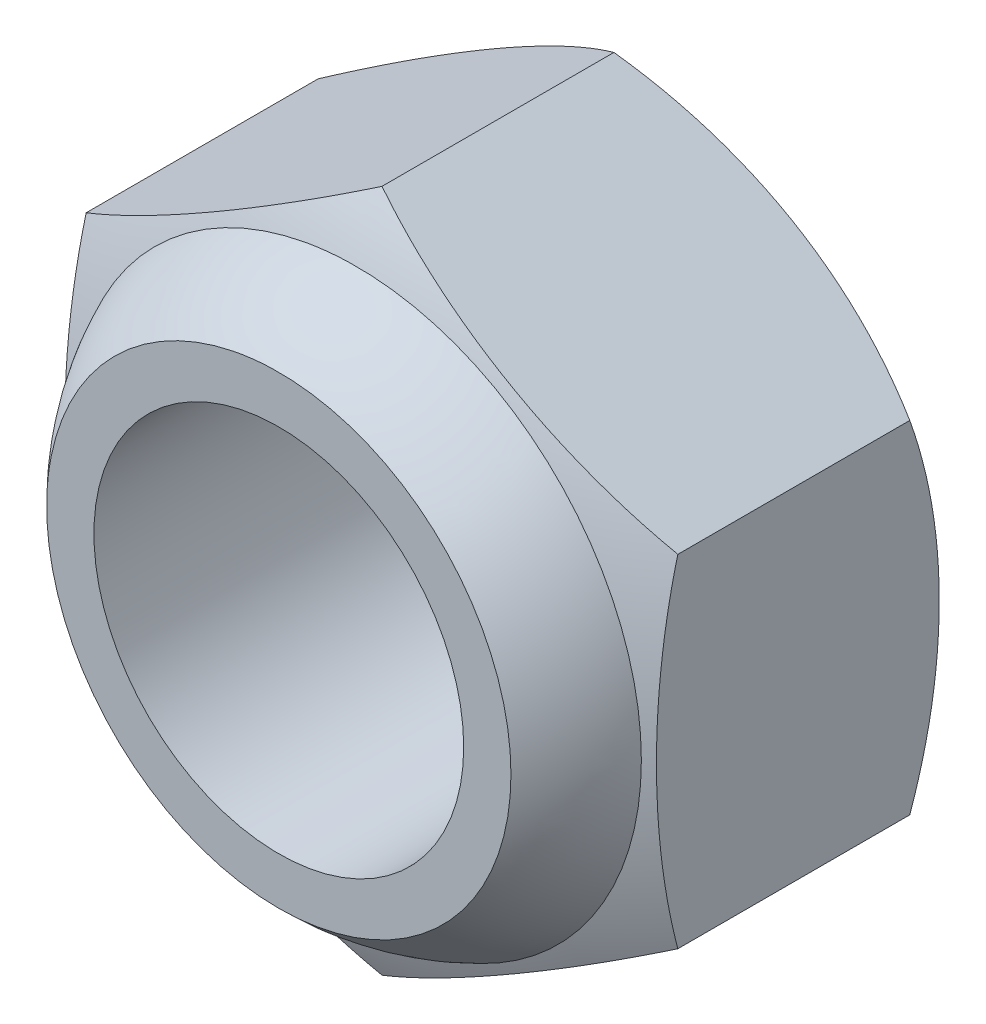
ISO-10303-21;
HEADER;
FILE_DESCRIPTION(('STEP AP214'),'2;1');
FILE_NAME('part.step','',(''),(''),'','','');
FILE_SCHEMA(('AUTOMOTIVE_DESIGN { 1 0 10303 214 1 1 1 1 }'));
ENDSEC;
DATA;
#1=APPLICATION_CONTEXT('core data for automotive mechanical design processes');
#2=APPLICATION_PROTOCOL_DEFINITION('international standard','automotive_design',2000,#1);
#3=PRODUCT_CONTEXT('',#1,'mechanical');
#4=PRODUCT('Part','Part','',(#3));
#5=PRODUCT_RELATED_PRODUCT_CATEGORY('part','',(#4));
#6=PRODUCT_DEFINITION_FORMATION('','',#4);
#7=PRODUCT_DEFINITION_CONTEXT('part definition',#1,'design');
#8=PRODUCT_DEFINITION('design','',#6,#7);
#9=PRODUCT_DEFINITION_SHAPE('','',#8);
#10=(LENGTH_UNIT() NAMED_UNIT(*) SI_UNIT(.MILLI.,.METRE.));
#11=(NAMED_UNIT(*) PLANE_ANGLE_UNIT() SI_UNIT($,.RADIAN.));
#12=(NAMED_UNIT(*) SI_UNIT($,.STERADIAN.) SOLID_ANGLE_UNIT());
#13=UNCERTAINTY_MEASURE_WITH_UNIT(LENGTH_MEASURE(1.E-05),#10,'distance_accuracy_value','');
#14=(GEOMETRIC_REPRESENTATION_CONTEXT(3) GLOBAL_UNCERTAINTY_ASSIGNED_CONTEXT((#13)) GLOBAL_UNIT_ASSIGNED_CONTEXT((#10,
#11,#12)) REPRESENTATION_CONTEXT('',''));
#15=CARTESIAN_POINT('',(0.,0.,0.));
#16=DIRECTION('',(0.,0.,1.));
#17=DIRECTION('',(1.,0.,0.));
#18=AXIS2_PLACEMENT_3D('',#15,#16,#17);
#19=CARTESIAN_POINT('',(0.,0.,5.));
#20=DIRECTION('',(0.,0.,1.));
#21=DIRECTION('',(1.,0.,0.));
#22=AXIS2_PLACEMENT_3D('',#19,#20,#21);
#23=PLANE('',#22);
#24=CARTESIAN_POINT('',(0.,0.,5.));
#25=DIRECTION('',(0.,0.,-1.));
#26=DIRECTION('',(-1.,0.,0.));
#27=AXIS2_PLACEMENT_3D('',#24,#25,#26);
#28=CIRCLE('',#27,2.5);
#29=CARTESIAN_POINT('',(2.5,0.,5.));
#30=VERTEX_POINT('',#29);
#31=EDGE_CURVE('E48',#30,#30,#28,.T.);
#32=ORIENTED_EDGE('',*,*,#31,.T.);
#33=EDGE_LOOP('',(#32));
#34=FACE_BOUND('',#33,.T.);
#35=CARTESIAN_POINT('',(0.,0.,5.));
#36=DIRECTION('',(0.,0.,1.));
#37=DIRECTION('',(-1.,0.,0.));
#38=AXIS2_PLACEMENT_3D('',#35,#36,#37);
#39=CIRCLE('',#38,3.13877117364591);
#40=CARTESIAN_POINT('',(0.,-3.1387711736459,5.));
#41=VERTEX_POINT('',#40);
#42=CARTESIAN_POINT('',(3.13877117364591,0.,5.));
#43=VERTEX_POINT('',#42);
#44=EDGE_CURVE('E317',#41,#43,#39,.T.);
#45=ORIENTED_EDGE('',*,*,#44,.T.);
#46=CARTESIAN_POINT('',(0.,0.,5.));
#47=DIRECTION('',(0.,0.,1.));
#48=DIRECTION('',(-1.,0.,0.));
#49=AXIS2_PLACEMENT_3D('',#46,#47,#48);
#50=CIRCLE('',#49,3.13877117364591);
#51=EDGE_CURVE('E310',#43,#41,#50,.T.);
#52=ORIENTED_EDGE('',*,*,#51,.T.);
#53=EDGE_LOOP('',(#45,#52));
#54=FACE_BOUND('',#53,.T.);
#55=ADVANCED_FACE('F17',(#34,#54),#23,.T.);
#56=CARTESIAN_POINT('',(0.,0.,0.));
#57=DIRECTION('',(0.,0.,1.));
#58=DIRECTION('',(1.,0.,0.));
#59=AXIS2_PLACEMENT_3D('',#56,#57,#58);
#60=PLANE('',#59);
#61=CARTESIAN_POINT('',(0.,0.,0.));
#62=DIRECTION('',(0.,0.,1.));
#63=DIRECTION('',(-1.,0.,0.));
#64=AXIS2_PLACEMENT_3D('',#61,#62,#63);
#65=CIRCLE('',#64,2.5);
#66=CARTESIAN_POINT('',(2.5,0.,0.));
#67=VERTEX_POINT('',#66);
#68=EDGE_CURVE('E41',#67,#67,#65,.T.);
#69=ORIENTED_EDGE('',*,*,#68,.T.);
#70=EDGE_LOOP('',(#69));
#71=FACE_BOUND('',#70,.T.);
#72=CARTESIAN_POINT('',(0.,0.,0.));
#73=DIRECTION('',(0.,0.,-1.));
#74=DIRECTION('',(0.,-1.,0.));
#75=AXIS2_PLACEMENT_3D('',#72,#73,#74);
#76=CIRCLE('',#75,3.87626323775086);
#77=CARTESIAN_POINT('',(0.,-3.87626323775087,0.));
#78=VERTEX_POINT('',#77);
#79=EDGE_CURVE('E256',#78,#78,#76,.T.);
#80=ORIENTED_EDGE('',*,*,#79,.T.);
#81=EDGE_LOOP('',(#80));
#82=FACE_BOUND('',#81,.T.);
#83=ADVANCED_FACE('F282',(#71,#82),#60,.F.);
#84=CARTESIAN_POINT('',(0.,-4.618802153517,0.));
#85=DIRECTION('',(0.5,-0.866025403784439,0.));
#86=DIRECTION('',(0.,0.,-1.));
#87=AXIS2_PLACEMENT_3D('',#84,#85,#86);
#88=PLANE('',#87);
#89=CARTESIAN_POINT('',(2.,-3.46410161513776,6.96188899722144));
#90=DIRECTION('',(0.5,-0.866025403784439,0.));
#91=DIRECTION('',(0.,0.,1.));
#92=AXIS2_PLACEMENT_3D('',#89,#90,#91);
#93=CIRCLE('',#92,6.89153938521516);
#94=CARTESIAN_POINT('',(0.,-4.618802153517,0.468817169138954));
#95=VERTEX_POINT('',#94);
#96=CARTESIAN_POINT('',(4.,-2.30940107675849,0.468817169138954));
#97=VERTEX_POINT('',#96);
#98=EDGE_CURVE('E408',#95,#97,#93,.T.);
#99=ORIENTED_EDGE('',*,*,#98,.T.);
#100=DIRECTION('',(0.,0.,1.));
#101=VECTOR('',#100,1.);
#102=CARTESIAN_POINT('',(4.,-2.3094010767585,0.));
#103=LINE('',#102,#101);
#104=CARTESIAN_POINT('',(4.,-2.30940107675849,3.60465735901138));
#105=VERTEX_POINT('',#104);
#106=EDGE_CURVE('E11',#97,#105,#103,.T.);
#107=ORIENTED_EDGE('',*,*,#106,.T.);
#108=CARTESIAN_POINT('',(0.,-4.61880215351702,3.60465735901137));
#109=CARTESIAN_POINT('',(0.0844692944981408,-4.57001999356269,3.63030472736693));
#110=CARTESIAN_POINT('',(0.169328832522611,-4.52097734452246,3.65415830776273));
#111=CARTESIAN_POINT('',(0.338245354867737,-4.42336415488436,3.69794268289454));
#112=CARTESIAN_POINT('',(0.422290334925305,-4.37480040655943,3.71793490760941));
#113=CARTESIAN_POINT('',(0.589958993725086,-4.27799811130783,3.75433795389298));
#114=CARTESIAN_POINT('',(0.67357579049099,-4.22976256836302,3.77078855096586));
#115=CARTESIAN_POINT('',(0.840801305462031,-4.13334877989157,3.80041271407598));
#116=CARTESIAN_POINT('',(0.92440761145618,-4.08517164061104,3.81360355710757));
#117=CARTESIAN_POINT('',(1.09134376760302,-3.98881247462849,3.83690021581602));
#118=CARTESIAN_POINT('',(1.17467211300332,-3.94063233408011,3.84702467062216));
#119=CARTESIAN_POINT('',(1.34047210813282,-3.84476504314221,3.86418970173584));
#120=CARTESIAN_POINT('',(1.42294078971601,-3.79707963948973,3.87126870625553));
#121=CARTESIAN_POINT('',(1.58765940562038,-3.7019423477994,3.88251184995009));
#122=CARTESIAN_POINT('',(1.66990837366383,-3.6544904836348,3.88669037848018));
#123=CARTESIAN_POINT('',(1.83478194516825,-3.55941130840055,3.89225175692093));
#124=CARTESIAN_POINT('',(1.91740685696352,-3.51178396364291,3.89362478718686));
#125=CARTESIAN_POINT('',(2.08250545377078,-3.41646989105462,3.89362277834582));
#126=CARTESIAN_POINT('',(2.16497920620485,-3.3687832799571,3.89225065532059));
#127=CARTESIAN_POINT('',(2.32968152694303,-3.27359746287484,3.88669241097333));
#128=CARTESIAN_POINT('',(2.41191021491103,-3.22609808011147,3.88251293097547));
#129=CARTESIAN_POINT('',(2.57671447766954,-3.13098954047092,3.87127034005281));
#130=CARTESIAN_POINT('',(2.6592894626106,-3.08338122431807,3.86419144326954));
#131=CARTESIAN_POINT('',(2.82528610017591,-2.98766389195938,3.84702827093319));
#132=CARTESIAN_POINT('',(2.90870473321059,-2.93955645276478,3.83690596807769));
#133=CARTESIAN_POINT('',(3.07523322781194,-2.84339413208622,3.81366224418682));
#134=CARTESIAN_POINT('',(3.15834283424106,-2.79533931043673,3.80053874191018));
#135=CARTESIAN_POINT('',(3.32497836598632,-2.69903594960985,3.77102029167012));
#136=CARTESIAN_POINT('',(3.40850042541312,-2.6507901049521,3.75459463367981));
#137=CARTESIAN_POINT('',(3.57628149353847,-2.55392052562894,3.71820656176609));
#138=CARTESIAN_POINT('',(3.66053282024238,-2.50530194392586,3.69819488921132));
#139=CARTESIAN_POINT('',(3.83000418825486,-2.40751071558443,3.65432348730328));
#140=CARTESIAN_POINT('',(3.91521120064901,-2.3583456837128,3.63039648646879));
#141=CARTESIAN_POINT('',(4.00000000000002,-2.30940107675849,3.60465735901137));
#142=B_SPLINE_CURVE_WITH_KNOTS('',3,(#108,#109,#110,#111,#112,#113,#114,#115,#116,#117,#118,
#119,#120,#121,#122,#123,#124,#125,#126,#127,#128,#129,#130,#131,#132,#133,#134,#135,#136,#137,
#138,#139,#140,#141),.UNSPECIFIED.,.F.,.F.,(4,2,2,2,2,2,2,2,2,2,2,2,2,2,2,2,4),(0.,
0.302555167937506,0.599807154182585,0.89352299937183,1.1856470235933,1.47595797738453,
1.76248986326301,2.04758989531865,2.33368612057893,2.61947859704127,2.90459734842293,
3.19128950979145,3.48172429099673,3.77236109400859,4.06583748402699,4.36370667585589,
4.66736915586006),.UNSPECIFIED.);
#143=CARTESIAN_POINT('',(0.,-4.61880215351701,3.60465735901138));
#144=VERTEX_POINT('',#143);
#145=EDGE_CURVE('E149',#105,#144,#142,.F.);
#146=ORIENTED_EDGE('',*,*,#145,.T.);
#147=DIRECTION('',(0.,0.,1.));
#148=VECTOR('',#147,1.);
#149=CARTESIAN_POINT('',(0.,-4.618802153517,0.));
#150=LINE('',#149,#148);
#151=EDGE_CURVE('E28',#95,#144,#150,.T.);
#152=ORIENTED_EDGE('',*,*,#151,.F.);
#153=EDGE_LOOP('',(#99,#107,#146,#152));
#154=FACE_BOUND('',#153,.T.);
#155=ADVANCED_FACE('F274',(#154),#88,.T.);
#156=CARTESIAN_POINT('',(4.,-2.3094010767585,0.));
#157=DIRECTION('',(1.,0.,0.));
#158=DIRECTION('',(0.,-1.,0.));
#159=AXIS2_PLACEMENT_3D('',#156,#157,#158);
#160=PLANE('',#159);
#161=CARTESIAN_POINT('',(4.,0.,6.96188899722144));
#162=DIRECTION('',(1.,0.,0.));
#163=DIRECTION('',(0.,0.,1.));
#164=AXIS2_PLACEMENT_3D('',#161,#162,#163);
#165=CIRCLE('',#164,6.89153938521516);
#166=CARTESIAN_POINT('',(4.,2.30940107675851,0.468817169138955));
#167=VERTEX_POINT('',#166);
#168=EDGE_CURVE('E415',#97,#167,#165,.T.);
#169=ORIENTED_EDGE('',*,*,#168,.T.);
#170=DIRECTION('',(0.,0.,1.));
#171=VECTOR('',#170,1.);
#172=CARTESIAN_POINT('',(4.,2.3094010767585,0.));
#173=LINE('',#172,#171);
#174=CARTESIAN_POINT('',(4.,2.30940107675851,3.60465735901138));
#175=VERTEX_POINT('',#174);
#176=EDGE_CURVE('E217',#167,#175,#173,.T.);
#177=ORIENTED_EDGE('',*,*,#176,.T.);
#178=CARTESIAN_POINT('',(4.00000000000002,0.,3.89362378223286));
#179=CARTESIAN_POINT('',(3.99998819719664,0.095038303610354,3.89362514646326));
#180=CARTESIAN_POINT('',(3.99996641984743,0.190078017092024,3.8922461806946));
#181=CARTESIAN_POINT('',(3.9999370917434,0.380104121350534,3.88668745073181));
#182=CARTESIAN_POINT('',(3.99992954530124,0.475090487244996,3.88250683801991));
#183=CARTESIAN_POINT('',(3.99996301337216,0.665522437432981,3.8712676584555));
#184=CARTESIAN_POINT('',(4.0000043487273,0.760966914781735,3.86419027857336));
#185=CARTESIAN_POINT('',(4.00006431956318,0.95278713333542,3.84703220467505));
#186=CARTESIAN_POINT('',(4.00008266520791,1.04915962486289,3.83691511926635));
#187=CARTESIAN_POINT('',(4.00006848104863,1.24092805305444,3.81373520518023));
#188=CARTESIAN_POINT('',(4.00003627443393,1.3363263005841,3.80069154273266));
#189=CARTESIAN_POINT('',(4.00000044981916,1.52809174375574,3.77129967825031));
#190=CARTESIAN_POINT('',(3.99999727192057,1.62445174942962,3.75490444642419));
#191=CARTESIAN_POINT('',(3.99999504976463,1.81835174796744,3.71853512282235));
#192=CARTESIAN_POINT('',(3.99999608349627,1.91588034971443,3.6985001336654));
#193=CARTESIAN_POINT('',(3.99999866535903,2.11224331435436,3.65452386718516));
#194=CARTESIAN_POINT('',(4.00000022401524,2.21106101515489,3.63050823308595));
#195=CARTESIAN_POINT('',(4.00000000000001,2.30940107675851,3.60465735901137));
#196=B_SPLINE_CURVE_WITH_KNOTS('',3,(#178,#179,#180,#181,#182,#183,#184,#185,#186,#187,#188,
#189,#190,#191,#192,#193,#194,#195),.UNSPECIFIED.,.F.,.F.,(4,2,2,2,2,2,2,2,4),(0.,
0.285106981500713,0.570300350665466,0.857376060706741,1.14803572855585,1.43684471439209,
1.73002516897892,2.0286590447242,2.33367755767986),.UNSPECIFIED.);
#197=CARTESIAN_POINT('',(4.,0.,3.89362378223287));
#198=VERTEX_POINT('',#197);
#199=EDGE_CURVE('E237',#175,#198,#196,.F.);
#200=ORIENTED_EDGE('',*,*,#199,.T.);
#201=CARTESIAN_POINT('',(4.00000000000002,-2.30940107675849,3.60465735901137));
#202=CARTESIAN_POINT('',(4.00000027122968,-2.21106723241989,3.63050657374951));
#203=CARTESIAN_POINT('',(3.99999935495743,-2.11225575649298,3.65452053145531));
#204=CARTESIAN_POINT('',(3.99999836565819,-1.91590083239483,3.69849476832372));
#205=CARTESIAN_POINT('',(3.99999827541718,-1.81837401027911,3.71852924357877));
#206=CARTESIAN_POINT('',(4.00000187121471,-1.62447355417245,3.75489864212389));
#207=CARTESIAN_POINT('',(4.00000548848029,-1.52811128434888,3.77129431973537));
#208=CARTESIAN_POINT('',(4.00003989558403,-1.33633784515323,3.80068842051633));
#209=CARTESIAN_POINT('',(4.00007028047921,-1.24093384634988,3.81373374477522));
#210=CARTESIAN_POINT('',(4.00008085356158,-1.04916621909009,3.83691508710785));
#211=CARTESIAN_POINT('',(4.00006072541666,-0.952800326261776,3.84703232642177));
#212=CARTESIAN_POINT('',(3.999999489555,-0.760988707923016,3.86419055651116));
#213=CARTESIAN_POINT('',(3.999958642595,-0.665546220800909,3.87126781011144));
#214=CARTESIAN_POINT('',(3.99992656419787,-0.475113960358615,3.88250694020535));
#215=CARTESIAN_POINT('',(3.99993501139162,-0.380125286394425,3.88668750180295));
#216=CARTESIAN_POINT('',(3.99996581253374,-0.190090588048334,3.89224624607006));
#217=CARTESIAN_POINT('',(3.99998816285156,-0.0950445851081156,3.89362515994118));
#218=CARTESIAN_POINT('',(4.00000000000002,0.,3.89362378223286));
#219=B_SPLINE_CURVE_WITH_KNOTS('',3,(#201,#202,#203,#204,#205,#206,#207,#208,#209,#210,#211,
#212,#213,#214,#215,#216,#217,#218),.UNSPECIFIED.,.F.,.F.,(4,2,2,2,2,2,2,2,4),(0.,
0.304999192432699,0.603627526743333,0.896814923469142,1.18564168877485,1.47628170630641,
1.76335141497695,2.04855169649338,2.33367753406475),.UNSPECIFIED.);
#220=EDGE_CURVE('E328',#198,#105,#219,.F.);
#221=ORIENTED_EDGE('',*,*,#220,.T.);
#222=ORIENTED_EDGE('',*,*,#106,.F.);
#223=EDGE_LOOP('',(#169,#177,#200,#221,#222));
#224=FACE_BOUND('',#223,.T.);
#225=ADVANCED_FACE('F19',(#224),#160,.T.);
#226=CARTESIAN_POINT('',(-4.,-2.3094010767585,0.));
#227=DIRECTION('',(-0.5,-0.866025403784439,0.));
#228=DIRECTION('',(-0.866025403784439,0.5,0.));
#229=AXIS2_PLACEMENT_3D('',#226,#227,#228);
#230=PLANE('',#229);
#231=CARTESIAN_POINT('',(-2.,-3.46410161513775,6.96188899722144));
#232=DIRECTION('',(-0.5,-0.866025403784439,0.));
#233=DIRECTION('',(0.,0.,1.));
#234=AXIS2_PLACEMENT_3D('',#231,#232,#233);
#235=CIRCLE('',#234,6.89153938521516);
#236=CARTESIAN_POINT('',(-4.,-2.3094010767585,0.468817169138954));
#237=VERTEX_POINT('',#236);
#238=EDGE_CURVE('E425',#237,#95,#235,.T.);
#239=ORIENTED_EDGE('',*,*,#238,.T.);
#240=ORIENTED_EDGE('',*,*,#151,.T.);
#241=CARTESIAN_POINT('',(-4.00000000000001,-2.30940107675851,3.60465735901137));
#242=CARTESIAN_POINT('',(-3.9152166421546,-2.35834260084172,3.63039481648444));
#243=CARTESIAN_POINT('',(-3.83001534755885,-2.40750500453119,3.65432015702155));
#244=CARTESIAN_POINT('',(-3.66055180915433,-2.50529339792776,3.69818955199515));
#245=CARTESIAN_POINT('',(-3.57630256079402,-2.55391178566992,3.71820072023641));
#246=CARTESIAN_POINT('',(-3.40852189404581,-2.65078266090926,3.75458886911543));
#247=CARTESIAN_POINT('',(-3.32499813788931,-2.69903001580491,3.77101496352426));
#248=CARTESIAN_POINT('',(-3.15835485722455,-2.79533625197662,3.80053567392391));
#249=CARTESIAN_POINT('',(-3.07523919311712,-2.84339246938167,3.81366086730653));
#250=CARTESIAN_POINT('',(-2.90871444719129,-2.93954906299808,3.83690515599298));
#251=CARTESIAN_POINT('',(-2.8253056893881,-2.98764936271224,3.84702689628129));
#252=CARTESIAN_POINT('',(-2.65932290272083,-3.08335875256089,3.86418936407551));
#253=CARTESIAN_POINT('',(-2.57675185821734,-3.13096624760365,3.87126787714157));
#254=CARTESIAN_POINT('',(-2.41194858762576,-3.22607716695744,3.8825103840425));
#255=CARTESIAN_POINT('',(-2.32971694214352,-3.27357976319644,3.88668992245678));
#256=CARTESIAN_POINT('',(-2.16500085284224,-3.36877361974655,3.89224929964395));
#257=CARTESIAN_POINT('',(-2.08251628222238,-3.41646505745475,3.89362227368176));
#258=CARTESIAN_POINT('',(-1.91741666662083,-3.51177688137877,3.8936252920098));
#259=CARTESIAN_POINT('',(-1.83480157008172,-3.55939717836943,3.89225310654109));
#260=CARTESIAN_POINT('',(-1.66994188440145,-3.65446845632234,3.8866928662485));
#261=CARTESIAN_POINT('',(-1.58769699014244,-3.70191946281041,3.88251439498581));
#262=CARTESIAN_POINT('',(-1.4229795190403,-3.79705894475036,3.87127117953101));
#263=CARTESIAN_POINT('',(-1.34050792449406,-3.84474739536289,3.8641918040966));
#264=CARTESIAN_POINT('',(-1.17469408454023,-3.94062270126894,3.84702606551676));
#265=CARTESIAN_POINT('',(-1.09135480916674,-3.98880777226604,3.83690104432864));
#266=CARTESIAN_POINT('',(-0.924412272617986,-4.08516726890055,3.81360492429188));
#267=CARTESIAN_POINT('',(-0.840810469038299,-4.13333986302364,3.80041575046162));
#268=CARTESIAN_POINT('',(-0.673591543762774,-4.22974839930192,3.77079383649159));
#269=CARTESIAN_POINT('',(-0.589976859258258,-4.27798323652641,3.75434368147481));
#270=CARTESIAN_POINT('',(-0.422308931183302,-4.374786542287,3.71794072667306));
#271=CARTESIAN_POINT('',(-0.338262597283965,-4.42335199926371,3.69794800391944));
#272=CARTESIAN_POINT('',(-0.169339483287757,-4.5209705378079,3.65416163598582));
#273=CARTESIAN_POINT('',(-0.0844747351583005,-4.57001680556475,3.63030640598292));
#274=CARTESIAN_POINT('',(0.,-4.61880215351702,3.60465735901137));
#275=B_SPLINE_CURVE_WITH_KNOTS('',3,(#241,#242,#243,#244,#245,#246,#247,#248,#249,#250,#251,
#252,#253,#254,#255,#256,#257,#258,#259,#260,#261,#262,#263,#264,#265,#266,#267,#268,#269,#270,
#271,#272,#273,#274),.UNSPECIFIED.,.F.,.F.,(4,2,2,2,2,2,2,2,2,2,2,2,2,2,2,2,4),(0.,
0.303643049474794,0.601506360130029,0.894989571452145,1.18564473283467,1.47604316449904,
1.7627237817914,2.04785505249492,2.33368291146376,2.61974302869812,2.90483117508257,
3.19137526934037,3.48172200127552,3.77382700070112,4.06753614873544,4.36479439404181,
4.66736914757197),.UNSPECIFIED.);
#276=CARTESIAN_POINT('',(-4.,-2.3094010767585,3.60465735901138));
#277=VERTEX_POINT('',#276);
#278=EDGE_CURVE('E136',#144,#277,#275,.F.);
#279=ORIENTED_EDGE('',*,*,#278,.T.);
#280=DIRECTION('',(0.,0.,1.));
#281=VECTOR('',#280,1.);
#282=CARTESIAN_POINT('',(-4.,-2.3094010767585,0.));
#283=LINE('',#282,#281);
#284=EDGE_CURVE('E124',#237,#277,#283,.T.);
#285=ORIENTED_EDGE('',*,*,#284,.F.);
#286=EDGE_LOOP('',(#239,#240,#279,#285));
#287=FACE_BOUND('',#286,.T.);
#288=ADVANCED_FACE('F141',(#287),#230,.T.);
#289=CARTESIAN_POINT('',(0.,0.,0.));
#290=DIRECTION('',(0.,0.,1.));
#291=DIRECTION('',(-1.,0.,0.));
#292=AXIS2_PLACEMENT_3D('',#289,#290,#291);
#293=CYLINDRICAL_SURFACE('',#292,2.5);
#294=ORIENTED_EDGE('',*,*,#68,.F.);
#295=EDGE_LOOP('',(#294));
#296=FACE_BOUND('',#295,.T.);
#297=ORIENTED_EDGE('',*,*,#31,.F.);
#298=EDGE_LOOP('',(#297));
#299=FACE_BOUND('',#298,.T.);
#300=ADVANCED_FACE('F453',(#296,#299),#293,.F.);
#301=CARTESIAN_POINT('',(-4.,2.3094010767585,0.));
#302=DIRECTION('',(-1.,0.,0.));
#303=DIRECTION('',(0.,1.,0.));
#304=AXIS2_PLACEMENT_3D('',#301,#302,#303);
#305=PLANE('',#304);
#306=CARTESIAN_POINT('',(-4.,0.,6.96188899722144));
#307=DIRECTION('',(-1.,0.,0.));
#308=DIRECTION('',(0.,0.,-1.));
#309=AXIS2_PLACEMENT_3D('',#306,#307,#308);
#310=CIRCLE('',#309,6.89153938521516);
#311=CARTESIAN_POINT('',(-4.,2.30940107675851,0.468817169138955));
#312=VERTEX_POINT('',#311);
#313=EDGE_CURVE('E135',#312,#237,#310,.T.);
#314=ORIENTED_EDGE('',*,*,#313,.T.);
#315=ORIENTED_EDGE('',*,*,#284,.T.);
#316=CARTESIAN_POINT('',(-4.00000000000001,2.30940107675852,3.60465735901137));
#317=CARTESIAN_POINT('',(-4.00000027343519,2.21106723169752,3.63050657126607));
#318=CARTESIAN_POINT('',(-3.99999935604814,2.11225575613005,3.65452053022819));
#319=CARTESIAN_POINT('',(-3.99999836458848,1.91590083273079,3.69849476953034));
#320=CARTESIAN_POINT('',(-3.99999827330088,1.81837401095487,3.718529245964));
#321=CARTESIAN_POINT('',(-4.00000187328781,1.62447355348307,3.75489863978901));
#322=CARTESIAN_POINT('',(-4.00000549567526,1.52811128199177,3.77129431163041));
#323=CARTESIAN_POINT('',(-4.00003988849094,1.33633784745697,3.80068842850574));
#324=CARTESIAN_POINT('',(-4.00007025433994,1.24093385486368,3.8137337742194));
#325=CARTESIAN_POINT('',(-4.00008087970736,1.04916905430031,3.83691471371692));
#326=CARTESIAN_POINT('',(-4.00006082496388,0.952805992538138,3.8470316173734));
#327=CARTESIAN_POINT('',(-4.00000072633022,0.76099804997121,3.8641893654434));
#328=CARTESIAN_POINT('',(-3.99996093059071,0.665556401261039,3.87126641127105));
#329=CARTESIAN_POINT('',(-3.99992776672625,0.475123789878368,3.88250571666351));
#330=CARTESIAN_POINT('',(-3.99993409882734,0.380133924582625,3.88668660340242));
#331=CARTESIAN_POINT('',(-3.99997053087034,0.190096028443037,3.89224516532764));
#332=CARTESIAN_POINT('',(-4.00000062500256,0.0950480174907733,3.89362352542397));
#333=CARTESIAN_POINT('',(-3.99999937507315,-0.0950365040609221,3.89362403901066));
#334=CARTESIAN_POINT('',(-3.99996803845327,-0.19007301465877,3.89224652634774));
#335=CARTESIAN_POINT('',(-3.9999316661548,-0.380095045958781,3.88668908413055));
#336=CARTESIAN_POINT('',(-3.99992663888558,-0.475080540655441,3.8825082590217));
#337=CARTESIAN_POINT('',(-3.99996244114047,-0.665512376100452,3.87126885811452));
#338=CARTESIAN_POINT('',(-4.00000357444037,-0.760957605253441,3.86419141584224));
#339=CARTESIAN_POINT('',(-4.0000637522067,-0.952781435098894,3.84703296788322));
#340=CARTESIAN_POINT('',(-4.00008251400159,-1.04915678119248,3.83691550711605));
#341=CARTESIAN_POINT('',(-4.00006863149669,-1.24092805313335,3.8137351613305));
#342=CARTESIAN_POINT('',(-4.00003631525097,-1.33632630061143,3.80069153083501));
#343=CARTESIAN_POINT('',(-4.00000040838945,-1.52809174374655,3.77129969032299));
#344=CARTESIAN_POINT('',(-3.99999725997414,-1.62445174943656,3.75490444990342));
#345=CARTESIAN_POINT('',(-3.99999506193796,-1.81835174798674,3.71853511927142));
#346=CARTESIAN_POINT('',(-3.9999960896477,-1.91588034972967,3.69850013186973));
#347=CARTESIAN_POINT('',(-3.99999865907788,-2.11224331435859,3.65452386901399));
#348=CARTESIAN_POINT('',(-4.00000021131785,-2.2110610151522,3.63050823678573));
#349=CARTESIAN_POINT('',(-4.00000000000001,-2.30940107675851,3.60465735901137));
#350=B_SPLINE_CURVE_WITH_KNOTS('',3,(#316,#317,#318,#319,#320,#321,#322,#323,#324,#325,#326,
#327,#328,#329,#330,#331,#332,#333,#334,#335,#336,#337,#338,#339,#340,#341,#342,#343,#344,#345,
#346,#347,#348,#349),.UNSPECIFIED.,.F.,.F.,(4,2,2,2,2,2,2,2,2,2,2,2,2,2,2,2,4),(0.,
0.304999192444194,0.603627526758129,0.896814923479819,1.18564168877497,1.47627311321655,
1.76334041233133,2.04854380092287,2.33367748022221,2.61877662048851,2.90396688280063,
3.19104500224332,3.48171326261156,3.77052224845834,4.06370270304928,4.36233657879127,
4.66735509173547),.UNSPECIFIED.);
#351=CARTESIAN_POINT('',(-4.,2.30940107675851,3.60465735901138));
#352=VERTEX_POINT('',#351);
#353=EDGE_CURVE('E130',#277,#352,#350,.F.);
#354=ORIENTED_EDGE('',*,*,#353,.T.);
#355=DIRECTION('',(0.,0.,1.));
#356=VECTOR('',#355,1.);
#357=CARTESIAN_POINT('',(-4.,2.3094010767585,0.));
#358=LINE('',#357,#356);
#359=EDGE_CURVE('E137',#312,#352,#358,.T.);
#360=ORIENTED_EDGE('',*,*,#359,.F.);
#361=EDGE_LOOP('',(#314,#315,#354,#360));
#362=FACE_BOUND('',#361,.T.);
#363=ADVANCED_FACE('F125',(#362),#305,.T.);
#364=CARTESIAN_POINT('',(0.,4.61880215351701,0.));
#365=DIRECTION('',(-0.5,0.866025403784438,0.));
#366=DIRECTION('',(0.,0.,1.));
#367=AXIS2_PLACEMENT_3D('',#364,#365,#366);
#368=PLANE('',#367);
#369=CARTESIAN_POINT('',(-2.,3.46410161513775,6.96188899722144));
#370=DIRECTION('',(-0.5,0.866025403784439,0.));
#371=DIRECTION('',(0.,0.,-1.));
#372=AXIS2_PLACEMENT_3D('',#369,#370,#371);
#373=CIRCLE('',#372,6.89153938521516);
#374=CARTESIAN_POINT('',(0.,4.618802153517,0.468817169138955));
#375=VERTEX_POINT('',#374);
#376=EDGE_CURVE('E416',#375,#312,#373,.T.);
#377=ORIENTED_EDGE('',*,*,#376,.T.);
#378=ORIENTED_EDGE('',*,*,#359,.T.);
#379=CARTESIAN_POINT('',(0.,4.61880215351702,3.60465735901137));
#380=CARTESIAN_POINT('',(-0.0844692944981529,4.57001999356269,3.63030472736693));
#381=CARTESIAN_POINT('',(-0.169328832522635,4.52097734452245,3.65415830776273));
#382=CARTESIAN_POINT('',(-0.338245354867776,4.42336415488434,3.69794268289455));
#383=CARTESIAN_POINT('',(-0.422290334925347,4.37480040655941,3.71793490760942));
#384=CARTESIAN_POINT('',(-0.589958993725127,4.2779981113078,3.75433795389299));
#385=CARTESIAN_POINT('',(-0.673575790491025,4.22976256836299,3.77078855096587));
#386=CARTESIAN_POINT('',(-0.84080130546205,4.13334877989155,3.80041271407598));
#387=CARTESIAN_POINT('',(-0.924407611456189,4.08517164061103,3.81360355710757));
#388=CARTESIAN_POINT('',(-1.09134376760302,3.98881247462848,3.83690021581602));
#389=CARTESIAN_POINT('',(-1.17467211300332,3.9406323340801,3.84702467062217));
#390=CARTESIAN_POINT('',(-1.34047210813283,3.84476504314221,3.86418970173584));
#391=CARTESIAN_POINT('',(-1.42294078971602,3.79707963948973,3.87126870625553));
#392=CARTESIAN_POINT('',(-1.58765940562038,3.70194234779939,3.8825118499501));
#393=CARTESIAN_POINT('',(-1.66990837366382,3.65449048363476,3.88669037848019));
#394=CARTESIAN_POINT('',(-1.83478194516827,3.55941130840056,3.89225175692093));
#395=CARTESIAN_POINT('',(-1.91740685696356,3.51178396364297,3.89362478718683));
#396=CARTESIAN_POINT('',(-2.08250545377358,3.41646989105288,3.89362277834587));
#397=CARTESIAN_POINT('',(-2.16497920621036,3.3687832799535,3.89225065532064));
#398=CARTESIAN_POINT('',(-2.32968152695201,3.27359746286841,3.88669241097335));
#399=CARTESIAN_POINT('',(-2.41191021492073,3.22609808010407,3.88251293097552));
#400=CARTESIAN_POINT('',(-2.57671447767893,3.1309895404629,3.8712703400529));
#401=CARTESIAN_POINT('',(-2.65928946261893,3.0833812243104,3.86419144326969));
#402=CARTESIAN_POINT('',(-2.82528610018076,2.98766389195448,3.84702827093325));
#403=CARTESIAN_POINT('',(-2.90870473321301,2.93955645276232,3.83690596807767));
#404=CARTESIAN_POINT('',(-3.07523322781511,2.84339413208542,3.81366224418607));
#405=CARTESIAN_POINT('',(-3.15834283424737,2.79533931043516,3.80053874190856));
#406=CARTESIAN_POINT('',(-3.32497836599667,2.69903594960674,3.77102029166733));
#407=CARTESIAN_POINT('',(-3.40850042542437,2.65079010494822,3.75459463367679));
#408=CARTESIAN_POINT('',(-3.57628149354951,2.55392052562439,3.71820656176302));
#409=CARTESIAN_POINT('',(-3.66053282025233,2.50530194392141,3.69819488920851));
#410=CARTESIAN_POINT('',(-3.8300041882607,2.40751071558146,3.65432348730153));
#411=CARTESIAN_POINT('',(-3.91521120065185,2.3583456837112,3.63039648646792));
#412=CARTESIAN_POINT('',(-4.00000000000001,2.30940107675851,3.60465735901137));
#413=B_SPLINE_CURVE_WITH_KNOTS('',3,(#379,#380,#381,#382,#383,#384,#385,#386,#387,#388,#389,
#390,#391,#392,#393,#394,#395,#396,#397,#398,#399,#400,#401,#402,#403,#404,#405,#406,#407,#408,
#409,#410,#411,#412),.UNSPECIFIED.,.F.,.F.,(4,2,2,2,2,2,2,2,2,2,2,2,2,2,2,2,4),(0.,
0.302555167937545,0.599807154182637,0.89352299937187,1.1856470235933,1.47595797738454,
1.76248986326302,2.04758989531865,2.33368612057893,2.61947859705113,2.90459734843615,
3.1912895098014,3.48172429099679,3.77236109401827,4.06583748404023,4.36370667586605,
4.66736915586003),.UNSPECIFIED.);
#414=CARTESIAN_POINT('',(0.,4.618802153517,3.60465735901138));
#415=VERTEX_POINT('',#414);
#416=EDGE_CURVE('E154',#352,#415,#413,.F.);
#417=ORIENTED_EDGE('',*,*,#416,.T.);
#418=DIRECTION('',(0.,0.,1.));
#419=VECTOR('',#418,1.);
#420=CARTESIAN_POINT('',(0.,4.61880215351701,0.));
#421=LINE('',#420,#419);
#422=EDGE_CURVE('E228',#375,#415,#421,.T.);
#423=ORIENTED_EDGE('',*,*,#422,.F.);
#424=EDGE_LOOP('',(#377,#378,#417,#423));
#425=FACE_BOUND('',#424,.T.);
#426=ADVANCED_FACE('F178',(#425),#368,.T.);
#427=CARTESIAN_POINT('',(4.,2.3094010767585,0.));
#428=DIRECTION('',(0.5,0.866025403784439,0.));
#429=DIRECTION('',(0.,0.,-1.));
#430=AXIS2_PLACEMENT_3D('',#427,#428,#429);
#431=PLANE('',#430);
#432=CARTESIAN_POINT('',(2.,3.46410161513776,6.96188899722144));
#433=DIRECTION('',(0.5,0.866025403784439,0.));
#434=DIRECTION('',(0.,0.,-1.));
#435=AXIS2_PLACEMENT_3D('',#432,#433,#434);
#436=CIRCLE('',#435,6.89153938521516);
#437=EDGE_CURVE('E417',#167,#375,#436,.T.);
#438=ORIENTED_EDGE('',*,*,#437,.T.);
#439=ORIENTED_EDGE('',*,*,#422,.T.);
#440=CARTESIAN_POINT('',(4.00000000000001,2.30940107675851,3.60465735901137));
#441=CARTESIAN_POINT('',(3.91521664214797,2.3583426008455,3.63039481648647));
#442=CARTESIAN_POINT('',(3.83001534754524,2.40750500453818,3.6543201570256));
#443=CARTESIAN_POINT('',(3.66055180913116,2.5052933979382,3.69818955200166));
#444=CARTESIAN_POINT('',(3.57630256076832,2.55391178568058,3.71820072024354));
#445=CARTESIAN_POINT('',(3.40852189401963,2.65078266091838,3.75458886912244));
#446=CARTESIAN_POINT('',(3.32499813786523,2.69903001581222,3.77101496353073));
#447=CARTESIAN_POINT('',(3.15835485720986,2.79533625198032,3.80053567392767));
#448=CARTESIAN_POINT('',(3.07523919310976,2.84339246938354,3.81366086730829));
#449=CARTESIAN_POINT('',(2.90871444718568,2.93954906300374,3.83690515599303));
#450=CARTESIAN_POINT('',(2.82530568937687,2.98764936272355,3.84702689628115));
#451=CARTESIAN_POINT('',(2.65932290270153,3.08335875257862,3.86418936407519));
#452=CARTESIAN_POINT('',(2.5767518581956,3.13096624762217,3.87126787714139));
#453=CARTESIAN_POINT('',(2.4119485876033,3.22607716697455,3.88251038404238));
#454=CARTESIAN_POINT('',(2.32971694212276,3.27357976321132,3.88668992245672));
#455=CARTESIAN_POINT('',(2.16500085282945,3.36877361975483,3.89224929964386));
#456=CARTESIAN_POINT('',(2.08251628221585,3.41646505745865,3.89362227368171));
#457=CARTESIAN_POINT('',(1.91741666662411,3.51177688137677,3.89362529200984));
#458=CARTESIAN_POINT('',(1.83480157008855,3.5593971783659,3.89225310654105));
#459=CARTESIAN_POINT('',(1.66994188441313,3.65446845631711,3.88669286624845));
#460=CARTESIAN_POINT('',(1.58769699015541,3.701919462805,3.88251439498574));
#461=CARTESIAN_POINT('',(1.42297951905355,3.79705894474564,3.87127117953092));
#462=CARTESIAN_POINT('',(1.3405079245063,3.84474739535904,3.86419180409645));
#463=CARTESIAN_POINT('',(1.17469408454771,3.94062270126696,3.84702606551669));
#464=CARTESIAN_POINT('',(1.09135480917048,3.98880777226505,3.83690104432866));
#465=CARTESIAN_POINT('',(0.924412272620831,4.08516726889776,3.81360492429276));
#466=CARTESIAN_POINT('',(0.840810469043976,4.13333986301809,3.80041575046351));
#467=CARTESIAN_POINT('',(0.673591543772568,4.22974839929315,3.77079383649486));
#468=CARTESIAN_POINT('',(0.589976859269353,4.27798323651719,3.75434368147836));
#469=CARTESIAN_POINT('',(0.422308931194841,4.37478654227839,3.71794072667668));
#470=CARTESIAN_POINT('',(0.338262597294665,4.42335199925616,3.69794800392275));
#471=CARTESIAN_POINT('',(0.169339483294369,4.52097053780368,3.65416163598789));
#472=CARTESIAN_POINT('',(0.0844747351616815,4.57001680556278,3.63030640598396));
#473=CARTESIAN_POINT('',(0.,4.61880215351702,3.60465735901137));
#474=B_SPLINE_CURVE_WITH_KNOTS('',3,(#440,#441,#442,#443,#444,#445,#446,#447,#448,#449,#450,
#451,#452,#453,#454,#455,#456,#457,#458,#459,#460,#461,#462,#463,#464,#465,#466,#467,#468,#469,
#470,#471,#472,#473),.UNSPECIFIED.,.F.,.F.,(4,2,2,2,2,2,2,2,2,2,2,2,2,2,2,2,4),(0.,
0.303643049498497,0.601506360160905,0.894989571474699,1.18564473283483,1.47604316452209,
1.76272378182201,2.04785505251776,2.33368291146377,2.61974302868662,2.90483117506744,
3.19137526932919,3.48172200127546,3.77382700068925,4.06753614871942,4.36479439402967,
4.66736914757199),.UNSPECIFIED.);
#475=EDGE_CURVE('E246',#415,#175,#474,.F.);
#476=ORIENTED_EDGE('',*,*,#475,.T.);
#477=ORIENTED_EDGE('',*,*,#176,.F.);
#478=EDGE_LOOP('',(#438,#439,#476,#477));
#479=FACE_BOUND('',#478,.T.);
#480=ADVANCED_FACE('F284',(#479),#431,.T.);
#481=CARTESIAN_POINT('',(3.13877117364591,0.,5.));
#482=CARTESIAN_POINT('',(3.13877117364591,-3.13877117364591,5.));
#483=CARTESIAN_POINT('',(0.,-3.13877117364591,5.));
#484=CARTESIAN_POINT('',(-3.13877117364591,-3.13877117364591,5.));
#485=CARTESIAN_POINT('',(-3.13877117364591,0.,5.));
#486=CARTESIAN_POINT('',(-3.13877117364591,3.13877117364591,5.));
#487=CARTESIAN_POINT('',(0.,3.13877117364591,5.));
#488=CARTESIAN_POINT('',(3.13877117364591,3.13877117364591,5.));
#489=CARTESIAN_POINT('',(3.13877117364591,0.,5.));
#490=CARTESIAN_POINT('',(3.5971255449465,0.,4.54460091258308));
#491=CARTESIAN_POINT('',(3.5971255449465,-3.5971255449465,4.54460091258308));
#492=CARTESIAN_POINT('',(0.,-3.5971255449465,4.54460091258308));
#493=CARTESIAN_POINT('',(-3.5971255449465,-3.5971255449465,4.54460091258308));
#494=CARTESIAN_POINT('',(-3.5971255449465,0.,4.54460091258308));
#495=CARTESIAN_POINT('',(-3.5971255449465,3.5971255449465,4.54460091258308));
#496=CARTESIAN_POINT('',(0.,3.5971255449465,4.54460091258308));
#497=CARTESIAN_POINT('',(3.5971255449465,3.5971255449465,4.54460091258308));
#498=CARTESIAN_POINT('',(3.5971255449465,0.,4.54460091258308));
#499=CARTESIAN_POINT('',(3.85402366464513,0.,3.9517430758247));
#500=CARTESIAN_POINT('',(3.85402366464513,-3.85402366464513,3.9517430758247));
#501=CARTESIAN_POINT('',(0.,-3.85402366464513,3.9517430758247));
#502=CARTESIAN_POINT('',(-3.85402366464513,-3.85402366464513,3.9517430758247));
#503=CARTESIAN_POINT('',(-3.85402366464513,0.,3.9517430758247));
#504=CARTESIAN_POINT('',(-3.85402366464513,3.85402366464513,3.9517430758247));
#505=CARTESIAN_POINT('',(0.,3.85402366464513,3.9517430758247));
#506=CARTESIAN_POINT('',(3.85402366464513,3.85402366464513,3.9517430758247));
#507=CARTESIAN_POINT('',(3.85402366464513,0.,3.9517430758247));
#508=(BOUNDED_SURFACE() B_SPLINE_SURFACE(2,2,((#481,#482,#483,#484,#485,#486,#487,#488,#489),
(#490,#491,#492,#493,#494,#495,#496,#497,#498),(#499,#500,#501,#502,#503,#504,#505,#506,#507)),
.UNSPECIFIED.,.F.,.T.,.F.) B_SPLINE_SURFACE_WITH_KNOTS((3,3),(3,2,2,2,3),(-0.788632376686876,
-0.408897969407679),(-3.14159265358979,-1.5707963267949,0.,1.5707963267949,3.14159265358979),
.UNSPECIFIED.) GEOMETRIC_REPRESENTATION_ITEM() RATIONAL_B_SPLINE_SURFACE(((1.,0.707106781186548,
1.,0.707106781186548,1.,0.707106781186548,1.,0.707106781186548,1.),(0.982029306232323,
0.694399581760797,0.982029306232323,0.694399581760797,0.982029306232323,0.694399581760797,
0.982029306232323,0.694399581760797,0.982029306232323),(1.,0.707106781186548,1.,
0.707106781186548,1.,0.707106781186548,1.,0.707106781186548,1.))) REPRESENTATION_ITEM('') SURFACE());
#509=CARTESIAN_POINT('',(3.13877117364591,0.,5.));
#510=CARTESIAN_POINT('',(3.5971255449465,0.,4.54460091258308));
#511=CARTESIAN_POINT('',(3.85402366464513,0.,3.9517430758247));
#512=(BOUNDED_CURVE() B_SPLINE_CURVE(2,(#509,#510,#511),.UNSPECIFIED.,.F.,
.F.) B_SPLINE_CURVE_WITH_KNOTS((3,3),(-0.788632376686876,-0.408897969407679),
.UNSPECIFIED.) CURVE() GEOMETRIC_REPRESENTATION_ITEM() RATIONAL_B_SPLINE_CURVE((1.,
0.982029306232323,1.)) REPRESENTATION_ITEM(''));
#513=CARTESIAN_POINT('',(3.85402366464514,0.,3.95174307582469));
#514=VERTEX_POINT('',#513);
#515=EDGE_CURVE('E302',#43,#514,#512,.T.);
#516=CARTESIAN_POINT('',(0.,0.,3.9517430758247));
#517=DIRECTION('',(0.,0.,-1.));
#518=DIRECTION('',(1.,0.,0.));
#519=AXIS2_PLACEMENT_3D('',#516,#517,#518);
#520=CIRCLE('',#519,3.85402366464513);
#521=CARTESIAN_POINT('',(0.,-3.85402366464514,3.9517430758247));
#522=VERTEX_POINT('',#521);
#523=EDGE_CURVE('E254',#522,#514,#520,.T.);
#524=CARTESIAN_POINT('',(0.,0.,3.9517430758247));
#525=DIRECTION('',(0.,0.,-1.));
#526=DIRECTION('',(1.,0.,0.));
#527=AXIS2_PLACEMENT_3D('',#524,#525,#526);
#528=CIRCLE('',#527,3.85402366464513);
#529=EDGE_CURVE('E339',#514,#522,#528,.T.);
#530=ORIENTED_EDGE('',*,*,#44,.F.);
#531=ORIENTED_EDGE('',*,*,#51,.F.);
#532=ORIENTED_EDGE('',*,*,#515,.T.);
#533=ORIENTED_EDGE('',*,*,#523,.F.);
#534=ORIENTED_EDGE('',*,*,#529,.F.);
#535=ORIENTED_EDGE('',*,*,#515,.F.);
#536=EDGE_LOOP('',(#530,#531,#532,#533,#534,#535));
#537=FACE_BOUND('',#536,.T.);
#538=ADVANCED_FACE('F176',(#537),#508,.F.);
#539=CARTESIAN_POINT('',(3.85402366464514,0.,3.95174307582469));
#540=CARTESIAN_POINT('',(3.85402366464513,-3.85402366464513,3.95174307582469));
#541=CARTESIAN_POINT('',(0.,-3.85402366464514,3.95174307582469));
#542=CARTESIAN_POINT('',(-3.85402366464513,-3.85402366464513,3.95174307582469));
#543=CARTESIAN_POINT('',(-3.85402366464514,0.,3.95174307582469));
#544=CARTESIAN_POINT('',(-3.85402366464513,3.85402366464513,3.95174307582469));
#545=CARTESIAN_POINT('',(0.,3.85402366464513,3.95174307582469));
#546=CARTESIAN_POINT('',(3.85402366464513,3.85402366464513,3.95174307582469));
#547=CARTESIAN_POINT('',(3.85402366464514,0.,3.95174307582469));
#548=CARTESIAN_POINT('',(4.24648595340438,0.,3.80039544828678));
#549=CARTESIAN_POINT('',(4.24648595340438,-4.24648595340438,3.80039544828678));
#550=CARTESIAN_POINT('',(0.,-4.24648595340438,3.80039544828678));
#551=CARTESIAN_POINT('',(-4.24648595340438,-4.24648595340438,3.80039544828678));
#552=CARTESIAN_POINT('',(-4.24648595340438,0.,3.80039544828678));
#553=CARTESIAN_POINT('',(-4.24648595340438,4.24648595340438,3.80039544828678));
#554=CARTESIAN_POINT('',(0.,4.24648595340438,3.80039544828678));
#555=CARTESIAN_POINT('',(4.24648595340438,4.24648595340438,3.80039544828678));
#556=CARTESIAN_POINT('',(4.24648595340438,0.,3.80039544828678));
#557=CARTESIAN_POINT('',(4.61880215351702,0.,3.60465735901137));
#558=CARTESIAN_POINT('',(4.61880215351702,-4.61880215351702,3.60465735901137));
#559=CARTESIAN_POINT('',(0.,-4.61880215351702,3.60465735901137));
#560=CARTESIAN_POINT('',(-4.61880215351702,-4.61880215351702,3.60465735901137));
#561=CARTESIAN_POINT('',(-4.61880215351702,0.,3.60465735901137));
#562=CARTESIAN_POINT('',(-4.61880215351702,4.61880215351702,3.60465735901137));
#563=CARTESIAN_POINT('',(0.,4.61880215351702,3.60465735901137));
#564=CARTESIAN_POINT('',(4.61880215351702,4.61880215351702,3.60465735901137));
#565=CARTESIAN_POINT('',(4.61880215351702,0.,3.60465735901137));
#566=(BOUNDED_SURFACE() B_SPLINE_SURFACE(2,2,((#539,#540,#541,#542,#543,#544,#545,#546,#547),
(#548,#549,#550,#551,#552,#553,#554,#555,#556),(#557,#558,#559,#560,#561,#562,#563,#564,#565)),
.UNSPECIFIED.,.F.,.T.,.F.) B_SPLINE_SURFACE_WITH_KNOTS((3,3),(3,2,2,2,3),(-1.20273361485434,
-1.08677661129997),(-3.14159265358979,-1.5707963267949,0.,1.5707963267949,3.14159265358979),
.UNSPECIFIED.) GEOMETRIC_REPRESENTATION_ITEM() RATIONAL_B_SPLINE_SURFACE(((1.,0.707106781186548,
1.,0.707106781186548,1.,0.707106781186548,1.,0.707106781186548,1.),(0.998319717435043,
0.705918641990557,0.998319717435043,0.705918641990557,0.998319717435043,0.705918641990557,
0.998319717435043,0.705918641990557,0.998319717435043),(1.,0.707106781186548,1.,
0.707106781186548,1.,0.707106781186548,1.,0.707106781186548,1.))) REPRESENTATION_ITEM('') SURFACE());
#567=CARTESIAN_POINT('',(3.85402366464514,0.,3.95174307582469));
#568=CARTESIAN_POINT('',(3.92732687500232,0.,3.92347471145892));
#569=CARTESIAN_POINT('',(4.00000000000001,0.,3.89362378223287));
#570=(BOUNDED_CURVE() B_SPLINE_CURVE(2,(#567,#568,#569),.UNSPECIFIED.,.F.,
.F.) B_SPLINE_CURVE_WITH_KNOTS((3,3),(-1.20273361485434,-1.18104579527019),
.UNSPECIFIED.) CURVE() GEOMETRIC_REPRESENTATION_ITEM() RATIONAL_B_SPLINE_CURVE((1.,
0.999685731227937,0.999489019899073)) REPRESENTATION_ITEM(''));
#571=EDGE_CURVE('E248',#514,#198,#570,.T.);
#572=ORIENTED_EDGE('',*,*,#523,.T.);
#573=ORIENTED_EDGE('',*,*,#571,.T.);
#574=ORIENTED_EDGE('',*,*,#199,.F.);
#575=ORIENTED_EDGE('',*,*,#475,.F.);
#576=ORIENTED_EDGE('',*,*,#416,.F.);
#577=ORIENTED_EDGE('',*,*,#353,.F.);
#578=ORIENTED_EDGE('',*,*,#278,.F.);
#579=ORIENTED_EDGE('',*,*,#145,.F.);
#580=ORIENTED_EDGE('',*,*,#220,.F.);
#581=ORIENTED_EDGE('',*,*,#571,.F.);
#582=ORIENTED_EDGE('',*,*,#529,.T.);
#583=EDGE_LOOP('',(#572,#573,#574,#575,#576,#577,#578,#579,#580,#581,#582));
#584=FACE_BOUND('',#583,.T.);
#585=ADVANCED_FACE('F152',(#584),#566,.F.);
#586=CARTESIAN_POINT('',(0.,0.,6.96188899722144));
#587=DIRECTION('',(0.,0.,1.));
#588=DIRECTION('',(1.,0.,0.));
#589=AXIS2_PLACEMENT_3D('',#586,#587,#588);
#590=SPHERICAL_SURFACE('',#589,7.96826926615634);
#591=ORIENTED_EDGE('',*,*,#79,.F.);
#592=EDGE_LOOP('',(#591));
#593=FACE_BOUND('',#592,.T.);
#594=ORIENTED_EDGE('',*,*,#238,.F.);
#595=ORIENTED_EDGE('',*,*,#313,.F.);
#596=ORIENTED_EDGE('',*,*,#376,.F.);
#597=ORIENTED_EDGE('',*,*,#437,.F.);
#598=ORIENTED_EDGE('',*,*,#168,.F.);
#599=ORIENTED_EDGE('',*,*,#98,.F.);
#600=EDGE_LOOP('',(#594,#595,#596,#597,#598,#599));
#601=FACE_BOUND('',#600,.T.);
#602=ADVANCED_FACE('F179',(#593,#601),#590,.T.);
#603=CLOSED_SHELL('',(#55,#83,#155,#225,#288,#300,#363,#426,#480,#538,#585,#602));
#604=MANIFOLD_SOLID_BREP('B1',#603);
#605=ADVANCED_BREP_SHAPE_REPRESENTATION('',(#18,#604),#14);
#606=SHAPE_DEFINITION_REPRESENTATION(#9,#605);
ENDSEC;
END-ISO-10303-21;
